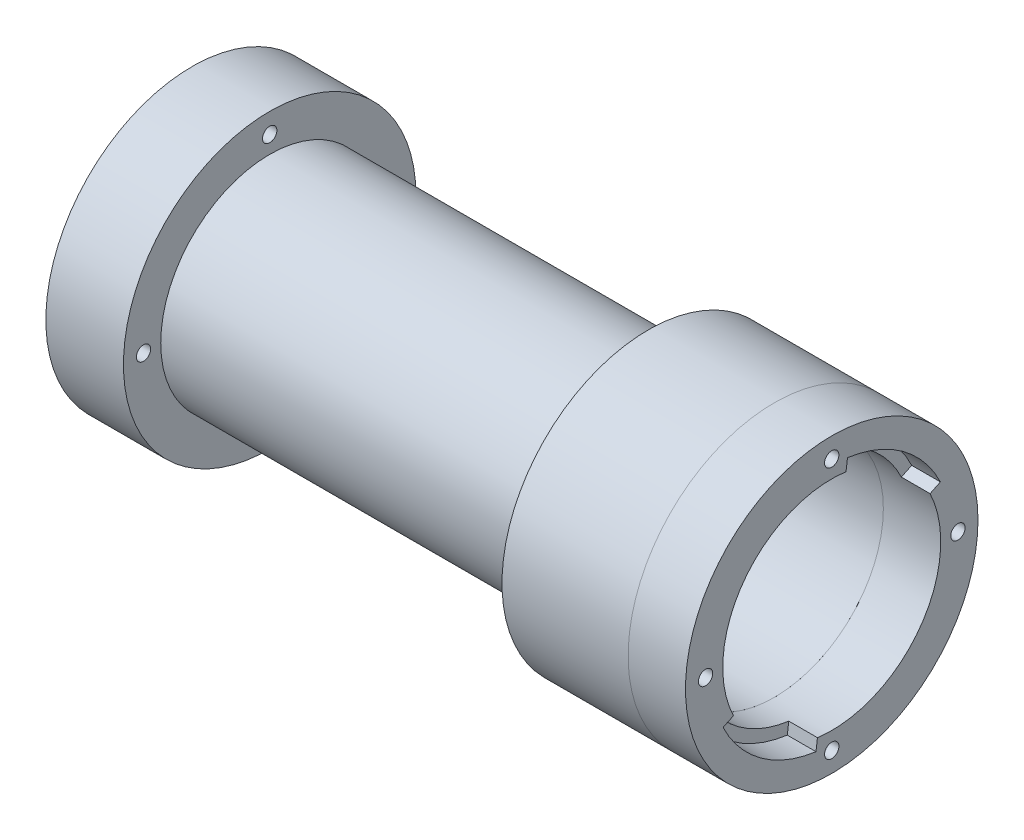
ISO-10303-21;
HEADER;
FILE_DESCRIPTION(('STEP AP214'),'2;1');
FILE_NAME('part.step','',(''),(''),'','','');
FILE_SCHEMA(('AUTOMOTIVE_DESIGN { 1 0 10303 214 1 1 1 1 }'));
ENDSEC;
DATA;
#1=APPLICATION_CONTEXT('core data for automotive mechanical design processes');
#2=APPLICATION_PROTOCOL_DEFINITION('international standard','automotive_design',2000,#1);
#3=PRODUCT_CONTEXT('',#1,'mechanical');
#4=PRODUCT('Part','Part','',(#3));
#5=PRODUCT_RELATED_PRODUCT_CATEGORY('part','',(#4));
#6=PRODUCT_DEFINITION_FORMATION('','',#4);
#7=PRODUCT_DEFINITION_CONTEXT('part definition',#1,'design');
#8=PRODUCT_DEFINITION('design','',#6,#7);
#9=PRODUCT_DEFINITION_SHAPE('','',#8);
#10=(LENGTH_UNIT() NAMED_UNIT(*) SI_UNIT(.MILLI.,.METRE.));
#11=(NAMED_UNIT(*) PLANE_ANGLE_UNIT() SI_UNIT($,.RADIAN.));
#12=(NAMED_UNIT(*) SI_UNIT($,.STERADIAN.) SOLID_ANGLE_UNIT());
#13=UNCERTAINTY_MEASURE_WITH_UNIT(LENGTH_MEASURE(1.E-05),#10,'distance_accuracy_value','');
#14=(GEOMETRIC_REPRESENTATION_CONTEXT(3) GLOBAL_UNCERTAINTY_ASSIGNED_CONTEXT((#13)) GLOBAL_UNIT_ASSIGNED_CONTEXT((#10,
#11,#12)) REPRESENTATION_CONTEXT('',''));
#15=CARTESIAN_POINT('',(0.,0.,0.));
#16=DIRECTION('',(0.,0.,1.));
#17=DIRECTION('',(1.,0.,0.));
#18=AXIS2_PLACEMENT_3D('',#15,#16,#17);
#19=CARTESIAN_POINT('',(193.98,0.,0.));
#20=DIRECTION('',(1.,0.,0.));
#21=DIRECTION('',(0.,0.,-1.));
#22=AXIS2_PLACEMENT_3D('',#19,#20,#21);
#23=PLANE('',#22);
#24=CARTESIAN_POINT('',(193.98,0.,0.));
#25=DIRECTION('',(1.,0.,0.));
#26=DIRECTION('',(0.,0.,-1.));
#27=AXIS2_PLACEMENT_3D('',#24,#25,#26);
#28=CIRCLE('',#27,51.);
#29=CARTESIAN_POINT('',(193.98,0.,-51.));
#30=VERTEX_POINT('',#29);
#31=EDGE_CURVE('E76',#30,#30,#28,.T.);
#32=ORIENTED_EDGE('',*,*,#31,.T.);
#33=EDGE_LOOP('',(#32));
#34=FACE_BOUND('',#33,.T.);
#35=CARTESIAN_POINT('',(193.98,0.,0.));
#36=DIRECTION('',(1.,0.,0.));
#37=DIRECTION('',(0.,0.,-1.));
#38=AXIS2_PLACEMENT_3D('',#35,#36,#37);
#39=CIRCLE('',#38,38.);
#40=CARTESIAN_POINT('',(193.98,0.,-38.));
#41=VERTEX_POINT('',#40);
#42=EDGE_CURVE('E70',#41,#41,#39,.T.);
#43=ORIENTED_EDGE('',*,*,#42,.F.);
#44=EDGE_LOOP('',(#43));
#45=FACE_BOUND('',#44,.T.);
#46=CARTESIAN_POINT('',(193.98,-44.,2.31588441170336E-12));
#47=DIRECTION('',(1.,0.,0.));
#48=DIRECTION('',(0.,0.,-1.));
#49=AXIS2_PLACEMENT_3D('',#46,#47,#48);
#50=CIRCLE('',#49,2.50000000000249);
#51=CARTESIAN_POINT('',(193.98,-44.,-2.50000000000018));
#52=VERTEX_POINT('',#51);
#53=EDGE_CURVE('E82',#52,#52,#50,.F.);
#54=ORIENTED_EDGE('',*,*,#53,.T.);
#55=EDGE_LOOP('',(#54));
#56=FACE_BOUND('',#55,.T.);
#57=CARTESIAN_POINT('',(193.98,44.,0.));
#58=DIRECTION('',(1.,0.,0.));
#59=DIRECTION('',(0.,0.,-1.));
#60=AXIS2_PLACEMENT_3D('',#57,#58,#59);
#61=CIRCLE('',#60,2.50000000000249);
#62=CARTESIAN_POINT('',(193.98,44.,-2.50000000000249));
#63=VERTEX_POINT('',#62);
#64=EDGE_CURVE('E53',#63,#63,#61,.F.);
#65=ORIENTED_EDGE('',*,*,#64,.T.);
#66=EDGE_LOOP('',(#65));
#67=FACE_BOUND('',#66,.T.);
#68=CARTESIAN_POINT('',(193.98,1.15794220585168E-12,44.0000000000012));
#69=DIRECTION('',(1.,0.,0.));
#70=DIRECTION('',(0.,0.,-1.));
#71=AXIS2_PLACEMENT_3D('',#68,#69,#70);
#72=CIRCLE('',#71,2.50000000000249);
#73=CARTESIAN_POINT('',(193.98,1.15794220585168E-12,41.4999999999987));
#74=VERTEX_POINT('',#73);
#75=EDGE_CURVE('E84',#74,#74,#72,.F.);
#76=ORIENTED_EDGE('',*,*,#75,.T.);
#77=EDGE_LOOP('',(#76));
#78=FACE_BOUND('',#77,.T.);
#79=CARTESIAN_POINT('',(193.98,-1.16333065176793E-12,-43.9999999999988));
#80=DIRECTION('',(1.,0.,0.));
#81=DIRECTION('',(0.,0.,-1.));
#82=AXIS2_PLACEMENT_3D('',#79,#80,#81);
#83=CIRCLE('',#82,2.50000000000248);
#84=CARTESIAN_POINT('',(193.98,-1.16333065176793E-12,-46.5000000000013));
#85=VERTEX_POINT('',#84);
#86=EDGE_CURVE('E79',#85,#85,#83,.F.);
#87=ORIENTED_EDGE('',*,*,#86,.T.);
#88=EDGE_LOOP('',(#87));
#89=FACE_BOUND('',#88,.T.);
#90=ADVANCED_FACE('F49',(#34,#45,#56,#67,#78,#89),#23,.T.);
#91=CARTESIAN_POINT('',(213.98,0.,0.));
#92=DIRECTION('',(-1.,0.,0.));
#93=DIRECTION('',(0.,0.,1.));
#94=AXIS2_PLACEMENT_3D('',#91,#92,#93);
#95=CYLINDRICAL_SURFACE('',#94,51.);
#96=CARTESIAN_POINT('',(150.,0.,0.));
#97=DIRECTION('',(1.,0.,0.));
#98=DIRECTION('',(0.,0.,-1.));
#99=AXIS2_PLACEMENT_3D('',#96,#97,#98);
#100=CIRCLE('',#99,51.);
#101=CARTESIAN_POINT('',(150.,0.,-51.));
#102=VERTEX_POINT('',#101);
#103=EDGE_CURVE('E66',#102,#102,#100,.T.);
#104=ORIENTED_EDGE('',*,*,#103,.T.);
#105=EDGE_LOOP('',(#104));
#106=FACE_BOUND('',#105,.T.);
#107=ORIENTED_EDGE('',*,*,#31,.F.);
#108=EDGE_LOOP('',(#107));
#109=FACE_BOUND('',#108,.T.);
#110=ADVANCED_FACE('F51',(#106,#109),#95,.T.);
#111=CARTESIAN_POINT('',(213.98,0.,0.));
#112=DIRECTION('',(-1.,0.,0.));
#113=DIRECTION('',(0.,0.,1.));
#114=AXIS2_PLACEMENT_3D('',#111,#112,#113);
#115=CYLINDRICAL_SURFACE('',#114,38.);
#116=CARTESIAN_POINT('',(150.,0.,0.));
#117=DIRECTION('',(1.,0.,0.));
#118=DIRECTION('',(0.,0.,-1.));
#119=AXIS2_PLACEMENT_3D('',#116,#117,#118);
#120=CIRCLE('',#119,38.);
#121=CARTESIAN_POINT('',(150.,0.,-38.));
#122=VERTEX_POINT('',#121);
#123=EDGE_CURVE('E69',#122,#122,#120,.T.);
#124=ORIENTED_EDGE('',*,*,#123,.F.);
#125=EDGE_LOOP('',(#124));
#126=FACE_BOUND('',#125,.T.);
#127=ORIENTED_EDGE('',*,*,#42,.T.);
#128=EDGE_LOOP('',(#127));
#129=FACE_BOUND('',#128,.T.);
#130=ADVANCED_FACE('F110',(#126,#129),#115,.F.);
#131=CARTESIAN_POINT('',(221.051067811873,-1.16333065176793E-12,-43.9999999999988));
#132=DIRECTION('',(-1.,0.,0.));
#133=DIRECTION('',(0.,0.,1.));
#134=AXIS2_PLACEMENT_3D('',#131,#132,#133);
#135=CYLINDRICAL_SURFACE('',#134,2.50000000000248);
#136=CARTESIAN_POINT('',(150.,-1.16333065176793E-12,-43.9999999999988));
#137=DIRECTION('',(1.,0.,0.));
#138=DIRECTION('',(0.,0.,-1.));
#139=AXIS2_PLACEMENT_3D('',#136,#137,#138);
#140=CIRCLE('',#139,2.50000000000248);
#141=CARTESIAN_POINT('',(150.,-1.16333065176793E-12,-46.5000000000013));
#142=VERTEX_POINT('',#141);
#143=EDGE_CURVE('E11',#142,#142,#140,.T.);
#144=ORIENTED_EDGE('',*,*,#143,.F.);
#145=EDGE_LOOP('',(#144));
#146=FACE_BOUND('',#145,.T.);
#147=ORIENTED_EDGE('',*,*,#86,.F.);
#148=EDGE_LOOP('',(#147));
#149=FACE_BOUND('',#148,.T.);
#150=ADVANCED_FACE('F116',(#146,#149),#135,.F.);
#151=CARTESIAN_POINT('',(221.051067811873,-44.,2.31588441170336E-12));
#152=DIRECTION('',(-1.,0.,0.));
#153=DIRECTION('',(0.,0.,1.));
#154=AXIS2_PLACEMENT_3D('',#151,#152,#153);
#155=CYLINDRICAL_SURFACE('',#154,2.50000000000249);
#156=CARTESIAN_POINT('',(150.,-44.,2.31588441170336E-12));
#157=DIRECTION('',(1.,0.,0.));
#158=DIRECTION('',(0.,0.,-1.));
#159=AXIS2_PLACEMENT_3D('',#156,#157,#158);
#160=CIRCLE('',#159,2.50000000000249);
#161=CARTESIAN_POINT('',(150.,-44.,-2.50000000000018));
#162=VERTEX_POINT('',#161);
#163=EDGE_CURVE('E57',#162,#162,#160,.T.);
#164=ORIENTED_EDGE('',*,*,#163,.F.);
#165=EDGE_LOOP('',(#164));
#166=FACE_BOUND('',#165,.T.);
#167=ORIENTED_EDGE('',*,*,#53,.F.);
#168=EDGE_LOOP('',(#167));
#169=FACE_BOUND('',#168,.T.);
#170=ADVANCED_FACE('F104',(#166,#169),#155,.F.);
#171=CARTESIAN_POINT('',(221.051067811873,1.15794220585168E-12,44.0000000000012));
#172=DIRECTION('',(-1.,0.,0.));
#173=DIRECTION('',(0.,0.,1.));
#174=AXIS2_PLACEMENT_3D('',#171,#172,#173);
#175=CYLINDRICAL_SURFACE('',#174,2.50000000000249);
#176=CARTESIAN_POINT('',(150.,1.15794220585168E-12,44.0000000000012));
#177=DIRECTION('',(1.,0.,0.));
#178=DIRECTION('',(0.,0.,-1.));
#179=AXIS2_PLACEMENT_3D('',#176,#177,#178);
#180=CIRCLE('',#179,2.50000000000249);
#181=CARTESIAN_POINT('',(150.,1.15794220585168E-12,41.4999999999987));
#182=VERTEX_POINT('',#181);
#183=EDGE_CURVE('E62',#182,#182,#180,.T.);
#184=ORIENTED_EDGE('',*,*,#183,.F.);
#185=EDGE_LOOP('',(#184));
#186=FACE_BOUND('',#185,.T.);
#187=ORIENTED_EDGE('',*,*,#75,.F.);
#188=EDGE_LOOP('',(#187));
#189=FACE_BOUND('',#188,.T.);
#190=ADVANCED_FACE('F95',(#186,#189),#175,.F.);
#191=CARTESIAN_POINT('',(221.051067811873,44.,0.));
#192=DIRECTION('',(-1.,0.,0.));
#193=DIRECTION('',(0.,0.,1.));
#194=AXIS2_PLACEMENT_3D('',#191,#192,#193);
#195=CYLINDRICAL_SURFACE('',#194,2.50000000000249);
#196=CARTESIAN_POINT('',(150.,44.,0.));
#197=DIRECTION('',(1.,0.,0.));
#198=DIRECTION('',(0.,0.,-1.));
#199=AXIS2_PLACEMENT_3D('',#196,#197,#198);
#200=CIRCLE('',#199,2.50000000000249);
#201=CARTESIAN_POINT('',(150.,44.,-2.50000000000249));
#202=VERTEX_POINT('',#201);
#203=EDGE_CURVE('E73',#202,#202,#200,.T.);
#204=ORIENTED_EDGE('',*,*,#203,.F.);
#205=EDGE_LOOP('',(#204));
#206=FACE_BOUND('',#205,.T.);
#207=ORIENTED_EDGE('',*,*,#64,.F.);
#208=EDGE_LOOP('',(#207));
#209=FACE_BOUND('',#208,.T.);
#210=ADVANCED_FACE('F92',(#206,#209),#195,.F.);
#211=CARTESIAN_POINT('',(150.,0.,0.));
#212=DIRECTION('',(1.,0.,0.));
#213=DIRECTION('',(0.,0.,-1.));
#214=AXIS2_PLACEMENT_3D('',#211,#212,#213);
#215=PLANE('',#214);
#216=ORIENTED_EDGE('',*,*,#203,.T.);
#217=EDGE_LOOP('',(#216));
#218=FACE_BOUND('',#217,.T.);
#219=ORIENTED_EDGE('',*,*,#183,.T.);
#220=EDGE_LOOP('',(#219));
#221=FACE_BOUND('',#220,.T.);
#222=ORIENTED_EDGE('',*,*,#163,.T.);
#223=EDGE_LOOP('',(#222));
#224=FACE_BOUND('',#223,.T.);
#225=ORIENTED_EDGE('',*,*,#143,.T.);
#226=EDGE_LOOP('',(#225));
#227=FACE_BOUND('',#226,.T.);
#228=ORIENTED_EDGE('',*,*,#103,.F.);
#229=EDGE_LOOP('',(#228));
#230=FACE_BOUND('',#229,.T.);
#231=ORIENTED_EDGE('',*,*,#123,.T.);
#232=EDGE_LOOP('',(#231));
#233=FACE_BOUND('',#232,.T.);
#234=ADVANCED_FACE('F94',(#218,#221,#224,#227,#230,#233),#215,.F.);
#235=CLOSED_SHELL('',(#90,#110,#130,#150,#170,#190,#210,#234));
#236=MANIFOLD_SOLID_BREP('B2',#235);
#237=CARTESIAN_POINT('',(193.98,0.,0.));
#238=DIRECTION('',(1.,0.,0.));
#239=DIRECTION('',(0.,0.,-1.));
#240=AXIS2_PLACEMENT_3D('',#237,#238,#239);
#241=PLANE('',#240);
#242=CARTESIAN_POINT('',(193.98,-1.16333065176793E-12,-43.9999999999988));
#243=DIRECTION('',(1.,0.,0.));
#244=DIRECTION('',(0.,0.,-1.));
#245=AXIS2_PLACEMENT_3D('',#242,#243,#244);
#246=CIRCLE('',#245,2.50000000000248);
#247=CARTESIAN_POINT('',(193.98,-1.16333065176793E-12,-46.5000000000013));
#248=VERTEX_POINT('',#247);
#249=EDGE_CURVE('E353',#248,#248,#246,.F.);
#250=ORIENTED_EDGE('',*,*,#249,.F.);
#251=EDGE_LOOP('',(#250));
#252=FACE_BOUND('',#251,.T.);
#253=CARTESIAN_POINT('',(193.98,1.15794220585168E-12,44.0000000000012));
#254=DIRECTION('',(1.,0.,0.));
#255=DIRECTION('',(0.,0.,-1.));
#256=AXIS2_PLACEMENT_3D('',#253,#254,#255);
#257=CIRCLE('',#256,2.50000000000249);
#258=CARTESIAN_POINT('',(193.98,1.15794220585168E-12,41.4999999999987));
#259=VERTEX_POINT('',#258);
#260=EDGE_CURVE('E347',#259,#259,#257,.F.);
#261=ORIENTED_EDGE('',*,*,#260,.F.);
#262=EDGE_LOOP('',(#261));
#263=FACE_BOUND('',#262,.T.);
#264=CARTESIAN_POINT('',(193.98,44.,0.));
#265=DIRECTION('',(1.,0.,0.));
#266=DIRECTION('',(0.,0.,-1.));
#267=AXIS2_PLACEMENT_3D('',#264,#265,#266);
#268=CIRCLE('',#267,2.50000000000249);
#269=CARTESIAN_POINT('',(193.98,44.,-2.50000000000249));
#270=VERTEX_POINT('',#269);
#271=EDGE_CURVE('E344',#270,#270,#268,.F.);
#272=ORIENTED_EDGE('',*,*,#271,.F.);
#273=EDGE_LOOP('',(#272));
#274=FACE_BOUND('',#273,.T.);
#275=CARTESIAN_POINT('',(193.98,-44.,2.31588441170336E-12));
#276=DIRECTION('',(1.,0.,0.));
#277=DIRECTION('',(0.,0.,-1.));
#278=AXIS2_PLACEMENT_3D('',#275,#276,#277);
#279=CIRCLE('',#278,2.50000000000249);
#280=CARTESIAN_POINT('',(193.98,-44.,-2.50000000000018));
#281=VERTEX_POINT('',#280);
#282=EDGE_CURVE('E350',#281,#281,#279,.F.);
#283=ORIENTED_EDGE('',*,*,#282,.F.);
#284=EDGE_LOOP('',(#283));
#285=FACE_BOUND('',#284,.T.);
#286=CARTESIAN_POINT('',(193.98,0.,0.));
#287=DIRECTION('',(1.,0.,0.));
#288=DIRECTION('',(0.,0.,-1.));
#289=AXIS2_PLACEMENT_3D('',#286,#287,#288);
#290=CIRCLE('',#289,38.);
#291=CARTESIAN_POINT('',(193.98,0.,-38.));
#292=VERTEX_POINT('',#291);
#293=EDGE_CURVE('E47',#292,#292,#290,.T.);
#294=ORIENTED_EDGE('',*,*,#293,.T.);
#295=EDGE_LOOP('',(#294));
#296=FACE_BOUND('',#295,.T.);
#297=CARTESIAN_POINT('',(193.98,0.,0.));
#298=DIRECTION('',(1.,0.,0.));
#299=DIRECTION('',(0.,0.,-1.));
#300=AXIS2_PLACEMENT_3D('',#297,#298,#299);
#301=CIRCLE('',#300,51.);
#302=CARTESIAN_POINT('',(193.98,0.,-51.));
#303=VERTEX_POINT('',#302);
#304=EDGE_CURVE('E204',#303,#303,#301,.T.);
#305=ORIENTED_EDGE('',*,*,#304,.F.);
#306=EDGE_LOOP('',(#305));
#307=FACE_BOUND('',#306,.T.);
#308=ADVANCED_FACE('F201',(#252,#263,#274,#285,#296,#307),#241,.F.);
#309=CARTESIAN_POINT('',(203.98,0.,0.));
#310=DIRECTION('',(1.,0.,0.));
#311=DIRECTION('',(0.,0.,-1.));
#312=AXIS2_PLACEMENT_3D('',#309,#310,#311);
#313=CYLINDRICAL_SURFACE('',#312,42.);
#314=CARTESIAN_POINT('',(213.98,0.,0.));
#315=DIRECTION('',(1.,0.,0.));
#316=DIRECTION('',(0.,0.,1.));
#317=AXIS2_PLACEMENT_3D('',#314,#315,#316);
#318=CIRCLE('',#317,42.);
#319=CARTESIAN_POINT('',(213.98,18.1283380226099,-37.886189575332));
#320=VERTEX_POINT('',#319);
#321=CARTESIAN_POINT('',(213.98,41.6379057132109,-5.50316343731083));
#322=VERTEX_POINT('',#321);
#323=EDGE_CURVE('E271',#320,#322,#318,.T.);
#324=ORIENTED_EDGE('',*,*,#323,.T.);
#325=DIRECTION('',(1.,0.,0.));
#326=VECTOR('',#325,1.);
#327=CARTESIAN_POINT('',(203.98,41.6379057132109,-5.50316343731083));
#328=LINE('',#327,#326);
#329=CARTESIAN_POINT('',(203.98,41.6379057132109,-5.50316343731083));
#330=VERTEX_POINT('',#329);
#331=EDGE_CURVE('E266',#330,#322,#328,.T.);
#332=ORIENTED_EDGE('',*,*,#331,.F.);
#333=CARTESIAN_POINT('',(203.98,0.,0.));
#334=DIRECTION('',(1.,0.,0.));
#335=DIRECTION('',(0.,0.,-1.));
#336=AXIS2_PLACEMENT_3D('',#333,#334,#335);
#337=CIRCLE('',#336,42.);
#338=CARTESIAN_POINT('',(203.98,18.1283380226099,-37.886189575332));
#339=VERTEX_POINT('',#338);
#340=EDGE_CURVE('E268',#339,#330,#337,.T.);
#341=ORIENTED_EDGE('',*,*,#340,.F.);
#342=DIRECTION('',(1.,0.,0.));
#343=VECTOR('',#342,1.);
#344=CARTESIAN_POINT('',(203.98,18.1283380226099,-37.886189575332));
#345=LINE('',#344,#343);
#346=EDGE_CURVE('E296',#339,#320,#345,.T.);
#347=ORIENTED_EDGE('',*,*,#346,.T.);
#348=EDGE_LOOP('',(#324,#332,#341,#347));
#349=FACE_BOUND('',#348,.T.);
#350=ADVANCED_FACE('F267',(#349),#313,.F.);
#351=CARTESIAN_POINT('',(203.98,0.,0.));
#352=DIRECTION('',(1.,0.,0.));
#353=DIRECTION('',(0.,0.,-1.));
#354=AXIS2_PLACEMENT_3D('',#351,#352,#353);
#355=CYLINDRICAL_SURFACE('',#354,42.);
#356=CARTESIAN_POINT('',(213.98,0.,0.));
#357=DIRECTION('',(1.,0.,0.));
#358=DIRECTION('',(0.,0.,1.));
#359=AXIS2_PLACEMENT_3D('',#356,#357,#358);
#360=CIRCLE('',#359,42.);
#361=CARTESIAN_POINT('',(213.98,-18.1283380226064,37.8861895753337));
#362=VERTEX_POINT('',#361);
#363=CARTESIAN_POINT('',(213.98,-41.6379057132105,5.50316343731468));
#364=VERTEX_POINT('',#363);
#365=EDGE_CURVE('E304',#362,#364,#360,.T.);
#366=ORIENTED_EDGE('',*,*,#365,.T.);
#367=DIRECTION('',(1.,0.,0.));
#368=VECTOR('',#367,1.);
#369=CARTESIAN_POINT('',(203.98,-41.6379057132105,5.50316343731468));
#370=LINE('',#369,#368);
#371=CARTESIAN_POINT('',(203.98,-41.6379057132105,5.50316343731468));
#372=VERTEX_POINT('',#371);
#373=EDGE_CURVE('E311',#372,#364,#370,.T.);
#374=ORIENTED_EDGE('',*,*,#373,.F.);
#375=CARTESIAN_POINT('',(203.98,0.,0.));
#376=DIRECTION('',(1.,0.,0.));
#377=DIRECTION('',(0.,0.,-1.));
#378=AXIS2_PLACEMENT_3D('',#375,#376,#377);
#379=CIRCLE('',#378,42.);
#380=CARTESIAN_POINT('',(203.98,-18.1283380226064,37.8861895753337));
#381=VERTEX_POINT('',#380);
#382=EDGE_CURVE('E302',#381,#372,#379,.T.);
#383=ORIENTED_EDGE('',*,*,#382,.F.);
#384=DIRECTION('',(1.,0.,0.));
#385=VECTOR('',#384,1.);
#386=CARTESIAN_POINT('',(203.98,-18.1283380226064,37.8861895753337));
#387=LINE('',#386,#385);
#388=EDGE_CURVE('E293',#381,#362,#387,.T.);
#389=ORIENTED_EDGE('',*,*,#388,.T.);
#390=EDGE_LOOP('',(#366,#374,#383,#389));
#391=FACE_BOUND('',#390,.T.);
#392=ADVANCED_FACE('F368',(#391),#355,.F.);
#393=CARTESIAN_POINT('',(203.98,-37.6723908833809,4.9790526337609));
#394=DIRECTION('',(0.,-0.131027700888445,-0.991378707457392));
#395=DIRECTION('',(0.,0.991378707457392,-0.131027700888445));
#396=AXIS2_PLACEMENT_3D('',#393,#394,#395);
#397=PLANE('',#396);
#398=DIRECTION('',(0.,0.991378707457392,-0.131027700888445));
#399=VECTOR('',#398,1.);
#400=CARTESIAN_POINT('',(213.98,-37.6723908833809,4.9790526337609));
#401=LINE('',#400,#399);
#402=CARTESIAN_POINT('',(213.98,-37.6723908833809,4.9790526337609));
#403=VERTEX_POINT('',#402);
#404=EDGE_CURVE('E312',#364,#403,#401,.T.);
#405=ORIENTED_EDGE('',*,*,#404,.T.);
#406=DIRECTION('',(1.,0.,0.));
#407=VECTOR('',#406,1.);
#408=CARTESIAN_POINT('',(203.98,-37.6723908833809,4.9790526337609));
#409=LINE('',#408,#407);
#410=CARTESIAN_POINT('',(203.98,-37.6723908833809,4.9790526337609));
#411=VERTEX_POINT('',#410);
#412=EDGE_CURVE('E321',#411,#403,#409,.T.);
#413=ORIENTED_EDGE('',*,*,#412,.F.);
#414=DIRECTION('',(0.,0.991378707457392,-0.131027700888445));
#415=VECTOR('',#414,1.);
#416=CARTESIAN_POINT('',(203.98,-37.6723908833809,4.9790526337609));
#417=LINE('',#416,#415);
#418=EDGE_CURVE('E223',#372,#411,#417,.T.);
#419=ORIENTED_EDGE('',*,*,#418,.F.);
#420=ORIENTED_EDGE('',*,*,#373,.T.);
#421=EDGE_LOOP('',(#405,#413,#419,#420));
#422=FACE_BOUND('',#421,.T.);
#423=ADVANCED_FACE('F400',(#422),#397,.F.);
#424=CARTESIAN_POINT('',(203.98,0.,0.));
#425=DIRECTION('',(1.,0.,0.));
#426=DIRECTION('',(0.,0.,-1.));
#427=AXIS2_PLACEMENT_3D('',#424,#425,#426);
#428=PLANE('',#427);
#429=ORIENTED_EDGE('',*,*,#382,.T.);
#430=ORIENTED_EDGE('',*,*,#418,.T.);
#431=CARTESIAN_POINT('',(203.98,0.,0.));
#432=DIRECTION('',(-1.,0.,0.));
#433=DIRECTION('',(0.,0.,-1.));
#434=AXIS2_PLACEMENT_3D('',#431,#432,#433);
#435=CIRCLE('',#434,38.);
#436=CARTESIAN_POINT('',(203.98,-16.401829639501,34.2779810443496));
#437=VERTEX_POINT('',#436);
#438=EDGE_CURVE('E306',#411,#437,#435,.T.);
#439=ORIENTED_EDGE('',*,*,#438,.T.);
#440=DIRECTION('',(0.,-0.431627095776342,0.90205213274604));
#441=VECTOR('',#440,1.);
#442=CARTESIAN_POINT('',(203.98,-16.401829639501,34.2779810443496));
#443=LINE('',#442,#441);
#444=EDGE_CURVE('E308',#437,#381,#443,.T.);
#445=ORIENTED_EDGE('',*,*,#444,.T.);
#446=EDGE_LOOP('',(#429,#430,#439,#445));
#447=FACE_BOUND('',#446,.T.);
#448=ADVANCED_FACE('F403',(#447),#428,.T.);
#449=CARTESIAN_POINT('',(203.98,-16.401829639501,34.2779810443496));
#450=DIRECTION('',(0.,0.902052132746041,0.431627095776342));
#451=DIRECTION('',(0.,-0.431627095776342,0.902052132746041));
#452=AXIS2_PLACEMENT_3D('',#449,#450,#451);
#453=PLANE('',#452);
#454=DIRECTION('',(0.,-0.431627095776342,0.90205213274604));
#455=VECTOR('',#454,1.);
#456=CARTESIAN_POINT('',(213.98,-16.401829639501,34.2779810443496));
#457=LINE('',#456,#455);
#458=CARTESIAN_POINT('',(213.98,-16.401829639501,34.2779810443496));
#459=VERTEX_POINT('',#458);
#460=EDGE_CURVE('E314',#459,#362,#457,.T.);
#461=ORIENTED_EDGE('',*,*,#460,.T.);
#462=ORIENTED_EDGE('',*,*,#388,.F.);
#463=ORIENTED_EDGE('',*,*,#444,.F.);
#464=DIRECTION('',(1.,0.,0.));
#465=VECTOR('',#464,1.);
#466=CARTESIAN_POINT('',(203.98,-16.401829639501,34.2779810443496));
#467=LINE('',#466,#465);
#468=EDGE_CURVE('E319',#437,#459,#467,.T.);
#469=ORIENTED_EDGE('',*,*,#468,.T.);
#470=EDGE_LOOP('',(#461,#462,#463,#469));
#471=FACE_BOUND('',#470,.T.);
#472=ADVANCED_FACE('F383',(#471),#453,.F.);
#473=CARTESIAN_POINT('',(213.98,0.,0.));
#474=DIRECTION('',(1.,0.,0.));
#475=DIRECTION('',(0.,0.,-1.));
#476=AXIS2_PLACEMENT_3D('',#473,#474,#475);
#477=PLANE('',#476);
#478=DIRECTION('',(0.,0.431627095776426,-0.902052132746));
#479=VECTOR('',#478,1.);
#480=CARTESIAN_POINT('',(213.98,16.4018296395042,-34.277981044348));
#481=LINE('',#480,#479);
#482=CARTESIAN_POINT('',(213.98,16.4018296395042,-34.277981044348));
#483=VERTEX_POINT('',#482);
#484=EDGE_CURVE('E286',#483,#320,#481,.T.);
#485=ORIENTED_EDGE('',*,*,#484,.F.);
#486=CARTESIAN_POINT('',(213.98,0.,0.));
#487=DIRECTION('',(1.,0.,0.));
#488=DIRECTION('',(0.,0.,-1.));
#489=AXIS2_PLACEMENT_3D('',#486,#487,#488);
#490=CIRCLE('',#489,38.);
#491=EDGE_CURVE('E329',#403,#483,#490,.T.);
#492=ORIENTED_EDGE('',*,*,#491,.F.);
#493=ORIENTED_EDGE('',*,*,#404,.F.);
#494=ORIENTED_EDGE('',*,*,#365,.F.);
#495=ORIENTED_EDGE('',*,*,#460,.F.);
#496=CARTESIAN_POINT('',(213.98,37.6723908833813,-4.97905263375742));
#497=VERTEX_POINT('',#496);
#498=EDGE_CURVE('E340',#497,#459,#490,.T.);
#499=ORIENTED_EDGE('',*,*,#498,.F.);
#500=DIRECTION('',(0.,-0.991378707457404,0.131027700888353));
#501=VECTOR('',#500,1.);
#502=CARTESIAN_POINT('',(213.98,37.6723908833813,-4.97905263375742));
#503=LINE('',#502,#501);
#504=EDGE_CURVE('E291',#322,#497,#503,.T.);
#505=ORIENTED_EDGE('',*,*,#504,.F.);
#506=ORIENTED_EDGE('',*,*,#323,.F.);
#507=EDGE_LOOP('',(#485,#492,#493,#494,#495,#499,#505,#506));
#508=FACE_BOUND('',#507,.T.);
#509=CARTESIAN_POINT('',(213.98,44.,0.));
#510=DIRECTION('',(1.,0.,0.));
#511=DIRECTION('',(0.,0.,-1.));
#512=AXIS2_PLACEMENT_3D('',#509,#510,#511);
#513=CIRCLE('',#512,2.50000000000249);
#514=CARTESIAN_POINT('',(213.98,44.,-2.50000000000249));
#515=VERTEX_POINT('',#514);
#516=EDGE_CURVE('E326',#515,#515,#513,.F.);
#517=ORIENTED_EDGE('',*,*,#516,.T.);
#518=EDGE_LOOP('',(#517));
#519=FACE_BOUND('',#518,.T.);
#520=CARTESIAN_POINT('',(213.98,1.15794220585168E-12,44.0000000000012));
#521=DIRECTION('',(1.,0.,0.));
#522=DIRECTION('',(0.,0.,-1.));
#523=AXIS2_PLACEMENT_3D('',#520,#521,#522);
#524=CIRCLE('',#523,2.50000000000249);
#525=CARTESIAN_POINT('',(213.98,1.15794220585168E-12,41.4999999999987));
#526=VERTEX_POINT('',#525);
#527=EDGE_CURVE('E330',#526,#526,#524,.F.);
#528=ORIENTED_EDGE('',*,*,#527,.T.);
#529=EDGE_LOOP('',(#528));
#530=FACE_BOUND('',#529,.T.);
#531=CARTESIAN_POINT('',(213.98,-44.,2.31588441170336E-12));
#532=DIRECTION('',(1.,0.,0.));
#533=DIRECTION('',(0.,0.,-1.));
#534=AXIS2_PLACEMENT_3D('',#531,#532,#533);
#535=CIRCLE('',#534,2.50000000000249);
#536=CARTESIAN_POINT('',(213.98,-44.,-2.50000000000018));
#537=VERTEX_POINT('',#536);
#538=EDGE_CURVE('E333',#537,#537,#535,.F.);
#539=ORIENTED_EDGE('',*,*,#538,.T.);
#540=EDGE_LOOP('',(#539));
#541=FACE_BOUND('',#540,.T.);
#542=CARTESIAN_POINT('',(213.98,-1.16333065176793E-12,-43.9999999999988));
#543=DIRECTION('',(1.,0.,0.));
#544=DIRECTION('',(0.,0.,-1.));
#545=AXIS2_PLACEMENT_3D('',#542,#543,#544);
#546=CIRCLE('',#545,2.50000000000248);
#547=CARTESIAN_POINT('',(213.98,-1.16333065176793E-12,-46.5000000000013));
#548=VERTEX_POINT('',#547);
#549=EDGE_CURVE('E298',#548,#548,#546,.F.);
#550=ORIENTED_EDGE('',*,*,#549,.T.);
#551=EDGE_LOOP('',(#550));
#552=FACE_BOUND('',#551,.T.);
#553=CARTESIAN_POINT('',(213.98,0.,0.));
#554=DIRECTION('',(1.,0.,0.));
#555=DIRECTION('',(0.,0.,-1.));
#556=AXIS2_PLACEMENT_3D('',#553,#554,#555);
#557=CIRCLE('',#556,51.);
#558=CARTESIAN_POINT('',(213.98,0.,-51.));
#559=VERTEX_POINT('',#558);
#560=EDGE_CURVE('E341',#559,#559,#557,.T.);
#561=ORIENTED_EDGE('',*,*,#560,.T.);
#562=EDGE_LOOP('',(#561));
#563=FACE_BOUND('',#562,.T.);
#564=ADVANCED_FACE('F380',(#508,#519,#530,#541,#552,#563),#477,.T.);
#565=CARTESIAN_POINT('',(221.051067811873,44.,0.));
#566=DIRECTION('',(-1.,0.,0.));
#567=DIRECTION('',(0.,0.,1.));
#568=AXIS2_PLACEMENT_3D('',#565,#566,#567);
#569=CYLINDRICAL_SURFACE('',#568,2.50000000000249);
#570=ORIENTED_EDGE('',*,*,#271,.T.);
#571=EDGE_LOOP('',(#570));
#572=FACE_BOUND('',#571,.T.);
#573=ORIENTED_EDGE('',*,*,#516,.F.);
#574=EDGE_LOOP('',(#573));
#575=FACE_BOUND('',#574,.T.);
#576=ADVANCED_FACE('F382',(#572,#575),#569,.F.);
#577=CARTESIAN_POINT('',(221.051067811873,1.15794220585168E-12,44.0000000000012));
#578=DIRECTION('',(-1.,0.,0.));
#579=DIRECTION('',(0.,0.,1.));
#580=AXIS2_PLACEMENT_3D('',#577,#578,#579);
#581=CYLINDRICAL_SURFACE('',#580,2.50000000000249);
#582=ORIENTED_EDGE('',*,*,#260,.T.);
#583=EDGE_LOOP('',(#582));
#584=FACE_BOUND('',#583,.T.);
#585=ORIENTED_EDGE('',*,*,#527,.F.);
#586=EDGE_LOOP('',(#585));
#587=FACE_BOUND('',#586,.T.);
#588=ADVANCED_FACE('F392',(#584,#587),#581,.F.);
#589=CARTESIAN_POINT('',(221.051067811873,-44.,2.31588441170336E-12));
#590=DIRECTION('',(-1.,0.,0.));
#591=DIRECTION('',(0.,0.,1.));
#592=AXIS2_PLACEMENT_3D('',#589,#590,#591);
#593=CYLINDRICAL_SURFACE('',#592,2.50000000000249);
#594=ORIENTED_EDGE('',*,*,#282,.T.);
#595=EDGE_LOOP('',(#594));
#596=FACE_BOUND('',#595,.T.);
#597=ORIENTED_EDGE('',*,*,#538,.F.);
#598=EDGE_LOOP('',(#597));
#599=FACE_BOUND('',#598,.T.);
#600=ADVANCED_FACE('F389',(#596,#599),#593,.F.);
#601=CARTESIAN_POINT('',(221.051067811873,-1.16333065176793E-12,-43.9999999999988));
#602=DIRECTION('',(-1.,0.,0.));
#603=DIRECTION('',(0.,0.,1.));
#604=AXIS2_PLACEMENT_3D('',#601,#602,#603);
#605=CYLINDRICAL_SURFACE('',#604,2.50000000000248);
#606=ORIENTED_EDGE('',*,*,#249,.T.);
#607=EDGE_LOOP('',(#606));
#608=FACE_BOUND('',#607,.T.);
#609=ORIENTED_EDGE('',*,*,#549,.F.);
#610=EDGE_LOOP('',(#609));
#611=FACE_BOUND('',#610,.T.);
#612=ADVANCED_FACE('F386',(#608,#611),#605,.F.);
#613=CARTESIAN_POINT('',(203.98,37.6723908833813,-4.97905263375742));
#614=DIRECTION('',(0.,0.131027700888353,0.991378707457404));
#615=DIRECTION('',(0.,-0.991378707457404,0.131027700888353));
#616=AXIS2_PLACEMENT_3D('',#613,#614,#615);
#617=PLANE('',#616);
#618=ORIENTED_EDGE('',*,*,#504,.T.);
#619=DIRECTION('',(1.,0.,0.));
#620=VECTOR('',#619,1.);
#621=CARTESIAN_POINT('',(203.98,37.6723908833813,-4.97905263375742));
#622=LINE('',#621,#620);
#623=CARTESIAN_POINT('',(203.98,37.6723908833813,-4.97905263375742));
#624=VERTEX_POINT('',#623);
#625=EDGE_CURVE('E274',#624,#497,#622,.T.);
#626=ORIENTED_EDGE('',*,*,#625,.F.);
#627=DIRECTION('',(0.,-0.991378707457404,0.131027700888353));
#628=VECTOR('',#627,1.);
#629=CARTESIAN_POINT('',(203.98,37.6723908833813,-4.97905263375742));
#630=LINE('',#629,#628);
#631=EDGE_CURVE('E215',#330,#624,#630,.T.);
#632=ORIENTED_EDGE('',*,*,#631,.F.);
#633=ORIENTED_EDGE('',*,*,#331,.T.);
#634=EDGE_LOOP('',(#618,#626,#632,#633));
#635=FACE_BOUND('',#634,.T.);
#636=ADVANCED_FACE('F277',(#635),#617,.F.);
#637=CARTESIAN_POINT('',(203.98,0.,0.));
#638=DIRECTION('',(1.,0.,0.));
#639=DIRECTION('',(0.,0.,-1.));
#640=AXIS2_PLACEMENT_3D('',#637,#638,#639);
#641=PLANE('',#640);
#642=ORIENTED_EDGE('',*,*,#340,.T.);
#643=ORIENTED_EDGE('',*,*,#631,.T.);
#644=CARTESIAN_POINT('',(203.98,0.,0.));
#645=DIRECTION('',(-1.,0.,0.));
#646=DIRECTION('',(0.,0.,-1.));
#647=AXIS2_PLACEMENT_3D('',#644,#645,#646);
#648=CIRCLE('',#647,38.);
#649=CARTESIAN_POINT('',(203.98,16.4018296395042,-34.277981044348));
#650=VERTEX_POINT('',#649);
#651=EDGE_CURVE('E280',#624,#650,#648,.T.);
#652=ORIENTED_EDGE('',*,*,#651,.T.);
#653=DIRECTION('',(0.,0.431627095776426,-0.902052132746));
#654=VECTOR('',#653,1.);
#655=CARTESIAN_POINT('',(203.98,16.4018296395042,-34.277981044348));
#656=LINE('',#655,#654);
#657=EDGE_CURVE('E275',#650,#339,#656,.T.);
#658=ORIENTED_EDGE('',*,*,#657,.T.);
#659=EDGE_LOOP('',(#642,#643,#652,#658));
#660=FACE_BOUND('',#659,.T.);
#661=ADVANCED_FACE('F283',(#660),#641,.T.);
#662=CARTESIAN_POINT('',(203.98,16.4018296395042,-34.277981044348));
#663=DIRECTION('',(0.,-0.902052132746,-0.431627095776426));
#664=DIRECTION('',(0.,0.431627095776426,-0.902052132746));
#665=AXIS2_PLACEMENT_3D('',#662,#663,#664);
#666=PLANE('',#665);
#667=ORIENTED_EDGE('',*,*,#484,.T.);
#668=ORIENTED_EDGE('',*,*,#346,.F.);
#669=ORIENTED_EDGE('',*,*,#657,.F.);
#670=DIRECTION('',(1.,0.,0.));
#671=VECTOR('',#670,1.);
#672=CARTESIAN_POINT('',(203.98,16.4018296395042,-34.277981044348));
#673=LINE('',#672,#671);
#674=EDGE_CURVE('E299',#650,#483,#673,.T.);
#675=ORIENTED_EDGE('',*,*,#674,.T.);
#676=EDGE_LOOP('',(#667,#668,#669,#675));
#677=FACE_BOUND('',#676,.T.);
#678=ADVANCED_FACE('F376',(#677),#666,.F.);
#679=CARTESIAN_POINT('',(213.98,0.,0.));
#680=DIRECTION('',(-1.,0.,0.));
#681=DIRECTION('',(0.,0.,1.));
#682=AXIS2_PLACEMENT_3D('',#679,#680,#681);
#683=CYLINDRICAL_SURFACE('',#682,38.);
#684=ORIENTED_EDGE('',*,*,#293,.F.);
#685=EDGE_LOOP('',(#684));
#686=FACE_BOUND('',#685,.T.);
#687=ORIENTED_EDGE('',*,*,#674,.F.);
#688=ORIENTED_EDGE('',*,*,#651,.F.);
#689=ORIENTED_EDGE('',*,*,#625,.T.);
#690=ORIENTED_EDGE('',*,*,#498,.T.);
#691=ORIENTED_EDGE('',*,*,#468,.F.);
#692=ORIENTED_EDGE('',*,*,#438,.F.);
#693=ORIENTED_EDGE('',*,*,#412,.T.);
#694=ORIENTED_EDGE('',*,*,#491,.T.);
#695=EDGE_LOOP('',(#687,#688,#689,#690,#691,#692,#693,#694));
#696=FACE_BOUND('',#695,.T.);
#697=ADVANCED_FACE('F372',(#686,#696),#683,.F.);
#698=CARTESIAN_POINT('',(213.98,0.,0.));
#699=DIRECTION('',(-1.,0.,0.));
#700=DIRECTION('',(0.,0.,1.));
#701=AXIS2_PLACEMENT_3D('',#698,#699,#700);
#702=CYLINDRICAL_SURFACE('',#701,51.);
#703=ORIENTED_EDGE('',*,*,#304,.T.);
#704=EDGE_LOOP('',(#703));
#705=FACE_BOUND('',#704,.T.);
#706=ORIENTED_EDGE('',*,*,#560,.F.);
#707=EDGE_LOOP('',(#706));
#708=FACE_BOUND('',#707,.T.);
#709=ADVANCED_FACE('F360',(#705,#708),#702,.T.);
#710=CLOSED_SHELL('',(#308,#350,#392,#423,#448,#472,#564,#576,#588,#600,#612,#636,#661,#678,
#697,#709));
#711=MANIFOLD_SOLID_BREP('B6',#710);
#712=CARTESIAN_POINT('',(150.,0.,0.));
#713=DIRECTION('',(-1.,0.,0.));
#714=DIRECTION('',(0.,0.,1.));
#715=AXIS2_PLACEMENT_3D('',#712,#713,#714);
#716=CYLINDRICAL_SURFACE('',#715,27.);
#717=CARTESIAN_POINT('',(18.,0.,0.));
#718=DIRECTION('',(1.,0.,0.));
#719=DIRECTION('',(0.,0.,-1.));
#720=AXIS2_PLACEMENT_3D('',#717,#718,#719);
#721=CIRCLE('',#720,27.);
#722=CARTESIAN_POINT('',(18.,0.,-27.));
#723=VERTEX_POINT('',#722);
#724=EDGE_CURVE('E593',#723,#723,#721,.T.);
#725=ORIENTED_EDGE('',*,*,#724,.F.);
#726=EDGE_LOOP('',(#725));
#727=FACE_BOUND('',#726,.T.);
#728=CARTESIAN_POINT('',(136.,0.,0.));
#729=DIRECTION('',(1.,0.,0.));
#730=DIRECTION('',(0.,0.,-1.));
#731=AXIS2_PLACEMENT_3D('',#728,#729,#730);
#732=CIRCLE('',#731,27.);
#733=CARTESIAN_POINT('',(136.,0.,-27.));
#734=VERTEX_POINT('',#733);
#735=EDGE_CURVE('E563',#734,#734,#732,.T.);
#736=ORIENTED_EDGE('',*,*,#735,.T.);
#737=EDGE_LOOP('',(#736));
#738=FACE_BOUND('',#737,.T.);
#739=ADVANCED_FACE('F559',(#727,#738),#716,.F.);
#740=CARTESIAN_POINT('',(-9.06,0.,0.));
#741=DIRECTION('',(1.,0.,0.));
#742=DIRECTION('',(0.,0.,-1.));
#743=AXIS2_PLACEMENT_3D('',#740,#741,#742);
#744=CYLINDRICAL_SURFACE('',#743,51.);
#745=CARTESIAN_POINT('',(-9.06,0.,0.));
#746=DIRECTION('',(1.,0.,0.));
#747=DIRECTION('',(0.,0.,-1.));
#748=AXIS2_PLACEMENT_3D('',#745,#746,#747);
#749=CIRCLE('',#748,51.);
#750=CARTESIAN_POINT('',(-9.06,0.,-51.));
#751=VERTEX_POINT('',#750);
#752=EDGE_CURVE('E200',#751,#751,#749,.T.);
#753=ORIENTED_EDGE('',*,*,#752,.T.);
#754=EDGE_LOOP('',(#753));
#755=FACE_BOUND('',#754,.T.);
#756=CARTESIAN_POINT('',(18.,0.,0.));
#757=DIRECTION('',(1.,0.,0.));
#758=DIRECTION('',(0.,0.,-1.));
#759=AXIS2_PLACEMENT_3D('',#756,#757,#758);
#760=CIRCLE('',#759,51.);
#761=CARTESIAN_POINT('',(18.,0.,-51.));
#762=VERTEX_POINT('',#761);
#763=EDGE_CURVE('E574',#762,#762,#760,.T.);
#764=ORIENTED_EDGE('',*,*,#763,.F.);
#765=EDGE_LOOP('',(#764));
#766=FACE_BOUND('',#765,.T.);
#767=ADVANCED_FACE('F561',(#755,#766),#744,.T.);
#768=CARTESIAN_POINT('',(-9.06,0.,0.));
#769=DIRECTION('',(1.,0.,0.));
#770=DIRECTION('',(0.,0.,-1.));
#771=AXIS2_PLACEMENT_3D('',#768,#769,#770);
#772=PLANE('',#771);
#773=CARTESIAN_POINT('',(-9.06,44.,0.));
#774=DIRECTION('',(-1.,0.,0.));
#775=DIRECTION('',(0.,0.,1.));
#776=AXIS2_PLACEMENT_3D('',#773,#774,#775);
#777=CIRCLE('',#776,2.50000000000249);
#778=CARTESIAN_POINT('',(-9.06,44.,2.50000000000249));
#779=VERTEX_POINT('',#778);
#780=EDGE_CURVE('E583',#779,#779,#777,.T.);
#781=ORIENTED_EDGE('',*,*,#780,.F.);
#782=EDGE_LOOP('',(#781));
#783=FACE_BOUND('',#782,.T.);
#784=CARTESIAN_POINT('',(-9.06,1.15794220585168E-12,44.0000000000012));
#785=DIRECTION('',(-1.,0.,0.));
#786=DIRECTION('',(0.,0.,1.));
#787=AXIS2_PLACEMENT_3D('',#784,#785,#786);
#788=CIRCLE('',#787,2.50000000000249);
#789=CARTESIAN_POINT('',(-9.06,1.15794220585168E-12,46.5000000000037));
#790=VERTEX_POINT('',#789);
#791=EDGE_CURVE('E778',#790,#790,#788,.T.);
#792=ORIENTED_EDGE('',*,*,#791,.F.);
#793=EDGE_LOOP('',(#792));
#794=FACE_BOUND('',#793,.T.);
#795=CARTESIAN_POINT('',(-9.06,-44.,2.31588441170336E-12));
#796=DIRECTION('',(-1.,0.,0.));
#797=DIRECTION('',(0.,0.,1.));
#798=AXIS2_PLACEMENT_3D('',#795,#796,#797);
#799=CIRCLE('',#798,2.50000000000249);
#800=CARTESIAN_POINT('',(-9.06,-44.,2.50000000000481));
#801=VERTEX_POINT('',#800);
#802=EDGE_CURVE('E781',#801,#801,#799,.T.);
#803=ORIENTED_EDGE('',*,*,#802,.F.);
#804=EDGE_LOOP('',(#803));
#805=FACE_BOUND('',#804,.T.);
#806=CARTESIAN_POINT('',(-9.06,-1.16333065176793E-12,-43.9999999999988));
#807=DIRECTION('',(-1.,0.,0.));
#808=DIRECTION('',(0.,0.,1.));
#809=AXIS2_PLACEMENT_3D('',#806,#807,#808);
#810=CIRCLE('',#809,2.50000000000248);
#811=CARTESIAN_POINT('',(-9.06,-1.16333065176793E-12,-41.4999999999964));
#812=VERTEX_POINT('',#811);
#813=EDGE_CURVE('E608',#812,#812,#810,.T.);
#814=ORIENTED_EDGE('',*,*,#813,.F.);
#815=EDGE_LOOP('',(#814));
#816=FACE_BOUND('',#815,.T.);
#817=CARTESIAN_POINT('',(-9.06,0.,0.));
#818=DIRECTION('',(1.,0.,0.));
#819=DIRECTION('',(0.,0.,-1.));
#820=AXIS2_PLACEMENT_3D('',#817,#818,#819);
#821=CIRCLE('',#820,31.);
#822=CARTESIAN_POINT('',(-9.06,0.,-31.));
#823=VERTEX_POINT('',#822);
#824=EDGE_CURVE('E568',#823,#823,#821,.T.);
#825=ORIENTED_EDGE('',*,*,#824,.T.);
#826=EDGE_LOOP('',(#825));
#827=FACE_BOUND('',#826,.T.);
#828=ORIENTED_EDGE('',*,*,#752,.F.);
#829=EDGE_LOOP('',(#828));
#830=FACE_BOUND('',#829,.T.);
#831=ADVANCED_FACE('F623',(#783,#794,#805,#816,#827,#830),#772,.F.);
#832=CARTESIAN_POINT('',(-9.06,0.,0.));
#833=DIRECTION('',(1.,0.,0.));
#834=DIRECTION('',(0.,0.,-1.));
#835=AXIS2_PLACEMENT_3D('',#832,#833,#834);
#836=CYLINDRICAL_SURFACE('',#835,31.);
#837=ORIENTED_EDGE('',*,*,#824,.F.);
#838=EDGE_LOOP('',(#837));
#839=FACE_BOUND('',#838,.T.);
#840=CARTESIAN_POINT('',(18.,0.,0.));
#841=DIRECTION('',(1.,0.,0.));
#842=DIRECTION('',(0.,0.,-1.));
#843=AXIS2_PLACEMENT_3D('',#840,#841,#842);
#844=CIRCLE('',#843,31.);
#845=CARTESIAN_POINT('',(18.,0.,-31.));
#846=VERTEX_POINT('',#845);
#847=EDGE_CURVE('E612',#846,#846,#844,.F.);
#848=ORIENTED_EDGE('',*,*,#847,.F.);
#849=EDGE_LOOP('',(#848));
#850=FACE_BOUND('',#849,.T.);
#851=ADVANCED_FACE('F628',(#839,#850),#836,.F.);
#852=CARTESIAN_POINT('',(18.,0.,0.));
#853=DIRECTION('',(1.,0.,0.));
#854=DIRECTION('',(0.,0.,-1.));
#855=AXIS2_PLACEMENT_3D('',#852,#853,#854);
#856=PLANE('',#855);
#857=CARTESIAN_POINT('',(18.,44.,0.));
#858=DIRECTION('',(1.,0.,0.));
#859=DIRECTION('',(0.,0.,-1.));
#860=AXIS2_PLACEMENT_3D('',#857,#858,#859);
#861=CIRCLE('',#860,2.50000000000249);
#862=CARTESIAN_POINT('',(18.,44.,-2.50000000000249));
#863=VERTEX_POINT('',#862);
#864=EDGE_CURVE('E590',#863,#863,#861,.T.);
#865=ORIENTED_EDGE('',*,*,#864,.F.);
#866=EDGE_LOOP('',(#865));
#867=FACE_BOUND('',#866,.T.);
#868=CARTESIAN_POINT('',(18.,1.15794220585168E-12,44.0000000000012));
#869=DIRECTION('',(1.,0.,0.));
#870=DIRECTION('',(0.,0.,-1.));
#871=AXIS2_PLACEMENT_3D('',#868,#869,#870);
#872=CIRCLE('',#871,2.50000000000249);
#873=CARTESIAN_POINT('',(18.,1.15794220585168E-12,41.4999999999987));
#874=VERTEX_POINT('',#873);
#875=EDGE_CURVE('E587',#874,#874,#872,.T.);
#876=ORIENTED_EDGE('',*,*,#875,.F.);
#877=EDGE_LOOP('',(#876));
#878=FACE_BOUND('',#877,.T.);
#879=CARTESIAN_POINT('',(18.,-44.,2.31588441170336E-12));
#880=DIRECTION('',(1.,0.,0.));
#881=DIRECTION('',(0.,0.,-1.));
#882=AXIS2_PLACEMENT_3D('',#879,#880,#881);
#883=CIRCLE('',#882,2.50000000000249);
#884=CARTESIAN_POINT('',(18.,-44.,-2.50000000000018));
#885=VERTEX_POINT('',#884);
#886=EDGE_CURVE('E582',#885,#885,#883,.T.);
#887=ORIENTED_EDGE('',*,*,#886,.F.);
#888=EDGE_LOOP('',(#887));
#889=FACE_BOUND('',#888,.T.);
#890=CARTESIAN_POINT('',(18.,-1.16333065176793E-12,-43.9999999999988));
#891=DIRECTION('',(1.,0.,0.));
#892=DIRECTION('',(0.,0.,-1.));
#893=AXIS2_PLACEMENT_3D('',#890,#891,#892);
#894=CIRCLE('',#893,2.50000000000248);
#895=CARTESIAN_POINT('',(18.,-1.16333065176793E-12,-46.5000000000013));
#896=VERTEX_POINT('',#895);
#897=EDGE_CURVE('E578',#896,#896,#894,.T.);
#898=ORIENTED_EDGE('',*,*,#897,.F.);
#899=EDGE_LOOP('',(#898));
#900=FACE_BOUND('',#899,.T.);
#901=CARTESIAN_POINT('',(18.,0.,0.));
#902=DIRECTION('',(1.,0.,0.));
#903=DIRECTION('',(0.,0.,-1.));
#904=AXIS2_PLACEMENT_3D('',#901,#902,#903);
#905=CIRCLE('',#904,38.);
#906=CARTESIAN_POINT('',(18.,0.,-38.));
#907=VERTEX_POINT('',#906);
#908=EDGE_CURVE('E598',#907,#907,#905,.T.);
#909=ORIENTED_EDGE('',*,*,#908,.F.);
#910=EDGE_LOOP('',(#909));
#911=FACE_BOUND('',#910,.T.);
#912=ORIENTED_EDGE('',*,*,#763,.T.);
#913=EDGE_LOOP('',(#912));
#914=FACE_BOUND('',#913,.T.);
#915=ADVANCED_FACE('F620',(#867,#878,#889,#900,#911,#914),#856,.T.);
#916=CARTESIAN_POINT('',(18.,0.,0.));
#917=DIRECTION('',(1.,0.,0.));
#918=DIRECTION('',(0.,0.,-1.));
#919=AXIS2_PLACEMENT_3D('',#916,#917,#918);
#920=PLANE('',#919);
#921=ORIENTED_EDGE('',*,*,#724,.T.);
#922=EDGE_LOOP('',(#921));
#923=FACE_BOUND('',#922,.T.);
#924=ORIENTED_EDGE('',*,*,#847,.T.);
#925=EDGE_LOOP('',(#924));
#926=FACE_BOUND('',#925,.T.);
#927=ADVANCED_FACE('F643',(#923,#926),#920,.F.);
#928=CARTESIAN_POINT('',(150.,0.,0.));
#929=DIRECTION('',(1.,0.,0.));
#930=DIRECTION('',(0.,0.,-1.));
#931=AXIS2_PLACEMENT_3D('',#928,#929,#930);
#932=PLANE('',#931);
#933=CARTESIAN_POINT('',(150.,0.,0.));
#934=DIRECTION('',(1.,0.,0.));
#935=DIRECTION('',(0.,0.,-1.));
#936=AXIS2_PLACEMENT_3D('',#933,#934,#935);
#937=CIRCLE('',#936,31.);
#938=CARTESIAN_POINT('',(150.,0.,-31.));
#939=VERTEX_POINT('',#938);
#940=EDGE_CURVE('E768',#939,#939,#937,.T.);
#941=ORIENTED_EDGE('',*,*,#940,.F.);
#942=EDGE_LOOP('',(#941));
#943=FACE_BOUND('',#942,.T.);
#944=CARTESIAN_POINT('',(150.,0.,0.));
#945=DIRECTION('',(1.,0.,0.));
#946=DIRECTION('',(0.,0.,-1.));
#947=AXIS2_PLACEMENT_3D('',#944,#945,#946);
#948=CIRCLE('',#947,38.);
#949=CARTESIAN_POINT('',(150.,0.,-38.));
#950=VERTEX_POINT('',#949);
#951=EDGE_CURVE('E604',#950,#950,#948,.T.);
#952=ORIENTED_EDGE('',*,*,#951,.T.);
#953=EDGE_LOOP('',(#952));
#954=FACE_BOUND('',#953,.T.);
#955=ADVANCED_FACE('F639',(#943,#954),#932,.T.);
#956=CARTESIAN_POINT('',(150.,0.,0.));
#957=DIRECTION('',(-1.,0.,0.));
#958=DIRECTION('',(0.,0.,1.));
#959=AXIS2_PLACEMENT_3D('',#956,#957,#958);
#960=CYLINDRICAL_SURFACE('',#959,38.);
#961=ORIENTED_EDGE('',*,*,#951,.F.);
#962=EDGE_LOOP('',(#961));
#963=FACE_BOUND('',#962,.T.);
#964=ORIENTED_EDGE('',*,*,#908,.T.);
#965=EDGE_LOOP('',(#964));
#966=FACE_BOUND('',#965,.T.);
#967=ADVANCED_FACE('F642',(#963,#966),#960,.T.);
#968=CARTESIAN_POINT('',(221.051067811873,-1.16333065176793E-12,-43.9999999999988));
#969=DIRECTION('',(-1.,0.,0.));
#970=DIRECTION('',(0.,0.,1.));
#971=AXIS2_PLACEMENT_3D('',#968,#969,#970);
#972=CYLINDRICAL_SURFACE('',#971,2.50000000000248);
#973=ORIENTED_EDGE('',*,*,#897,.T.);
#974=EDGE_LOOP('',(#973));
#975=FACE_BOUND('',#974,.T.);
#976=ORIENTED_EDGE('',*,*,#813,.T.);
#977=EDGE_LOOP('',(#976));
#978=FACE_BOUND('',#977,.T.);
#979=ADVANCED_FACE('F637',(#975,#978),#972,.F.);
#980=CARTESIAN_POINT('',(221.051067811873,-44.,2.31588441170336E-12));
#981=DIRECTION('',(-1.,0.,0.));
#982=DIRECTION('',(0.,0.,1.));
#983=AXIS2_PLACEMENT_3D('',#980,#981,#982);
#984=CYLINDRICAL_SURFACE('',#983,2.50000000000249);
#985=ORIENTED_EDGE('',*,*,#886,.T.);
#986=EDGE_LOOP('',(#985));
#987=FACE_BOUND('',#986,.T.);
#988=ORIENTED_EDGE('',*,*,#802,.T.);
#989=EDGE_LOOP('',(#988));
#990=FACE_BOUND('',#989,.T.);
#991=ADVANCED_FACE('F688',(#987,#990),#984,.F.);
#992=CARTESIAN_POINT('',(221.051067811873,1.15794220585168E-12,44.0000000000012));
#993=DIRECTION('',(-1.,0.,0.));
#994=DIRECTION('',(0.,0.,1.));
#995=AXIS2_PLACEMENT_3D('',#992,#993,#994);
#996=CYLINDRICAL_SURFACE('',#995,2.50000000000249);
#997=ORIENTED_EDGE('',*,*,#875,.T.);
#998=EDGE_LOOP('',(#997));
#999=FACE_BOUND('',#998,.T.);
#1000=ORIENTED_EDGE('',*,*,#791,.T.);
#1001=EDGE_LOOP('',(#1000));
#1002=FACE_BOUND('',#1001,.T.);
#1003=ADVANCED_FACE('F695',(#999,#1002),#996,.F.);
#1004=CARTESIAN_POINT('',(221.051067811873,44.,0.));
#1005=DIRECTION('',(-1.,0.,0.));
#1006=DIRECTION('',(0.,0.,1.));
#1007=AXIS2_PLACEMENT_3D('',#1004,#1005,#1006);
#1008=CYLINDRICAL_SURFACE('',#1007,2.50000000000249);
#1009=ORIENTED_EDGE('',*,*,#864,.T.);
#1010=EDGE_LOOP('',(#1009));
#1011=FACE_BOUND('',#1010,.T.);
#1012=ORIENTED_EDGE('',*,*,#780,.T.);
#1013=EDGE_LOOP('',(#1012));
#1014=FACE_BOUND('',#1013,.T.);
#1015=ADVANCED_FACE('F702',(#1011,#1014),#1008,.F.);
#1016=CARTESIAN_POINT('',(136.,0.,0.));
#1017=DIRECTION('',(1.,0.,0.));
#1018=DIRECTION('',(0.,0.,-1.));
#1019=AXIS2_PLACEMENT_3D('',#1016,#1017,#1018);
#1020=CYLINDRICAL_SURFACE('',#1019,31.);
#1021=CARTESIAN_POINT('',(136.,0.,0.));
#1022=DIRECTION('',(1.,0.,0.));
#1023=DIRECTION('',(0.,0.,-1.));
#1024=AXIS2_PLACEMENT_3D('',#1021,#1022,#1023);
#1025=CIRCLE('',#1024,31.);
#1026=CARTESIAN_POINT('',(136.,0.,-31.));
#1027=VERTEX_POINT('',#1026);
#1028=EDGE_CURVE('E766',#1027,#1027,#1025,.T.);
#1029=ORIENTED_EDGE('',*,*,#1028,.F.);
#1030=EDGE_LOOP('',(#1029));
#1031=FACE_BOUND('',#1030,.T.);
#1032=ORIENTED_EDGE('',*,*,#940,.T.);
#1033=EDGE_LOOP('',(#1032));
#1034=FACE_BOUND('',#1033,.T.);
#1035=ADVANCED_FACE('F710',(#1031,#1034),#1020,.F.);
#1036=CARTESIAN_POINT('',(136.,0.,0.));
#1037=DIRECTION('',(1.,0.,0.));
#1038=DIRECTION('',(0.,0.,-1.));
#1039=AXIS2_PLACEMENT_3D('',#1036,#1037,#1038);
#1040=PLANE('',#1039);
#1041=ORIENTED_EDGE('',*,*,#735,.F.);
#1042=EDGE_LOOP('',(#1041));
#1043=FACE_BOUND('',#1042,.T.);
#1044=ORIENTED_EDGE('',*,*,#1028,.T.);
#1045=EDGE_LOOP('',(#1044));
#1046=FACE_BOUND('',#1045,.T.);
#1047=ADVANCED_FACE('F716',(#1043,#1046),#1040,.T.);
#1048=CLOSED_SHELL('',(#739,#767,#831,#851,#915,#927,#955,#967,#979,#991,#1003,#1015,#1035,#1047));
#1049=MANIFOLD_SOLID_BREP('B41',#1048);
#1050=ADVANCED_BREP_SHAPE_REPRESENTATION('',(#18,#236,#711,#1049),#14);
#1051=SHAPE_DEFINITION_REPRESENTATION(#9,#1050);
ENDSEC;
END-ISO-10303-21;
